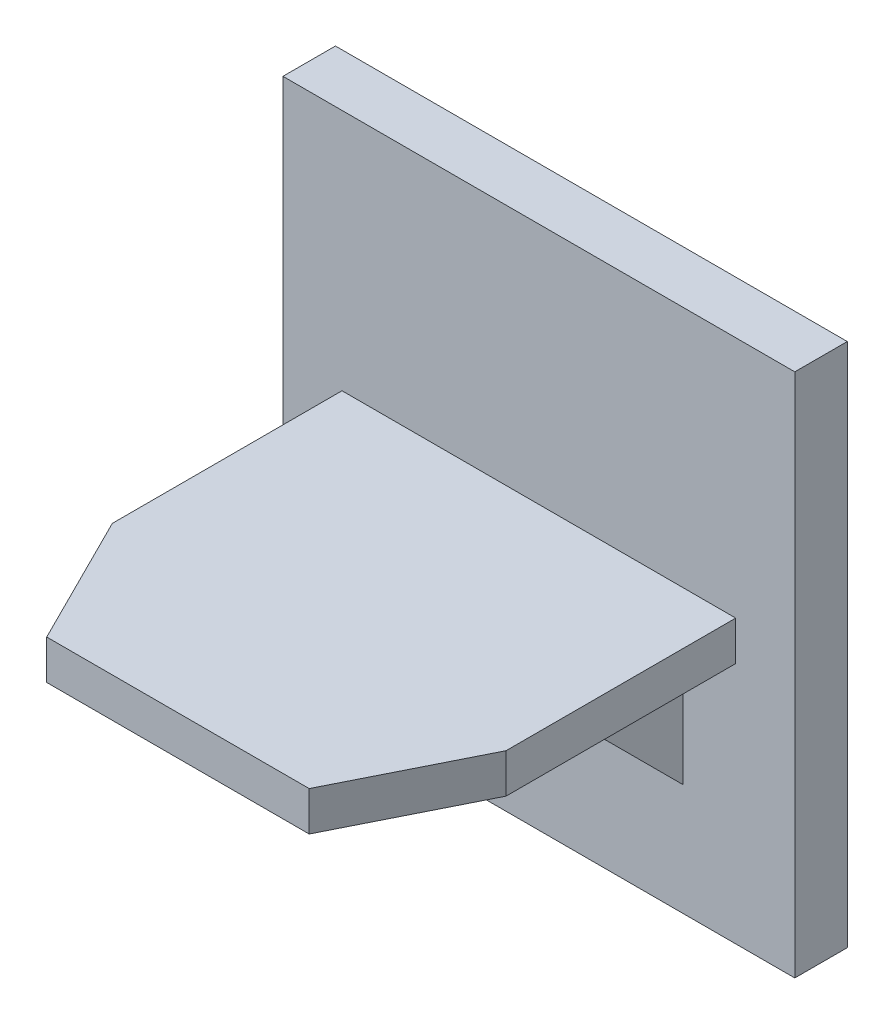
ISO-10303-21;
HEADER;
FILE_DESCRIPTION(('STEP AP214'),'2;1');
FILE_NAME('part.step','',(''),(''),'','','');
FILE_SCHEMA(('AUTOMOTIVE_DESIGN { 1 0 10303 214 1 1 1 1 }'));
ENDSEC;
DATA;
#1=APPLICATION_CONTEXT('core data for automotive mechanical design processes');
#2=APPLICATION_PROTOCOL_DEFINITION('international standard','automotive_design',2000,#1);
#3=PRODUCT_CONTEXT('',#1,'mechanical');
#4=PRODUCT('Part','Part','',(#3));
#5=PRODUCT_RELATED_PRODUCT_CATEGORY('part','',(#4));
#6=PRODUCT_DEFINITION_FORMATION('','',#4);
#7=PRODUCT_DEFINITION_CONTEXT('part definition',#1,'design');
#8=PRODUCT_DEFINITION('design','',#6,#7);
#9=PRODUCT_DEFINITION_SHAPE('','',#8);
#10=(LENGTH_UNIT() NAMED_UNIT(*) SI_UNIT(.MILLI.,.METRE.));
#11=(NAMED_UNIT(*) PLANE_ANGLE_UNIT() SI_UNIT($,.RADIAN.));
#12=(NAMED_UNIT(*) SI_UNIT($,.STERADIAN.) SOLID_ANGLE_UNIT());
#13=UNCERTAINTY_MEASURE_WITH_UNIT(LENGTH_MEASURE(1.E-05),#10,'distance_accuracy_value','');
#14=(GEOMETRIC_REPRESENTATION_CONTEXT(3) GLOBAL_UNCERTAINTY_ASSIGNED_CONTEXT((#13)) GLOBAL_UNIT_ASSIGNED_CONTEXT((#10,
#11,#12)) REPRESENTATION_CONTEXT('',''));
#15=CARTESIAN_POINT('',(0.,0.,0.));
#16=DIRECTION('',(0.,0.,1.));
#17=DIRECTION('',(1.,0.,0.));
#18=AXIS2_PLACEMENT_3D('',#15,#16,#17);
#19=CARTESIAN_POINT('',(0.,10.,0.));
#20=DIRECTION('',(0.,1.,0.));
#21=DIRECTION('',(1.,0.,0.));
#22=AXIS2_PLACEMENT_3D('',#19,#20,#21);
#23=PLANE('',#22);
#24=DIRECTION('',(0.,0.,-1.));
#25=VECTOR('',#24,1.);
#26=CARTESIAN_POINT('',(9.75,10.,0.5));
#27=LINE('',#26,#25);
#28=CARTESIAN_POINT('',(9.75,10.,1.));
#29=VERTEX_POINT('',#28);
#30=CARTESIAN_POINT('',(9.75,10.,-1.));
#31=VERTEX_POINT('',#30);
#32=EDGE_CURVE('E11',#29,#31,#27,.T.);
#33=ORIENTED_EDGE('',*,*,#32,.T.);
#34=DIRECTION('',(-1.,0.,0.));
#35=VECTOR('',#34,1.);
#36=CARTESIAN_POINT('',(10.,10.,-1.));
#37=LINE('',#36,#35);
#38=CARTESIAN_POINT('',(-9.75,10.,-1.));
#39=VERTEX_POINT('',#38);
#40=EDGE_CURVE('E44',#31,#39,#37,.T.);
#41=ORIENTED_EDGE('',*,*,#40,.T.);
#42=DIRECTION('',(0.,0.,1.));
#43=VECTOR('',#42,1.);
#44=CARTESIAN_POINT('',(-9.75,10.,-0.5));
#45=LINE('',#44,#43);
#46=CARTESIAN_POINT('',(-9.75,10.,1.));
#47=VERTEX_POINT('',#46);
#48=EDGE_CURVE('E234',#39,#47,#45,.T.);
#49=ORIENTED_EDGE('',*,*,#48,.T.);
#50=DIRECTION('',(1.,0.,0.));
#51=VECTOR('',#50,1.);
#52=CARTESIAN_POINT('',(-10.,10.,1.));
#53=LINE('',#52,#51);
#54=EDGE_CURVE('E264',#47,#29,#53,.T.);
#55=ORIENTED_EDGE('',*,*,#54,.T.);
#56=EDGE_LOOP('',(#33,#41,#49,#55));
#57=FACE_BOUND('',#56,.T.);
#58=ADVANCED_FACE('F18',(#57),#23,.T.);
#59=CARTESIAN_POINT('',(9.75,0.,1.));
#60=DIRECTION('',(1.,0.,0.));
#61=DIRECTION('',(0.,1.,0.));
#62=AXIS2_PLACEMENT_3D('',#59,#60,#61);
#63=PLANE('',#62);
#64=DIRECTION('',(0.,1.,0.));
#65=VECTOR('',#64,1.);
#66=CARTESIAN_POINT('',(9.75,0.,-1.));
#67=LINE('',#66,#65);
#68=CARTESIAN_POINT('',(9.75,-10.,-1.));
#69=VERTEX_POINT('',#68);
#70=EDGE_CURVE('E27',#69,#31,#67,.T.);
#71=ORIENTED_EDGE('',*,*,#70,.T.);
#72=ORIENTED_EDGE('',*,*,#32,.F.);
#73=DIRECTION('',(0.,-1.,0.));
#74=VECTOR('',#73,1.);
#75=CARTESIAN_POINT('',(9.75,0.,1.));
#76=LINE('',#75,#74);
#77=CARTESIAN_POINT('',(9.75,-10.,1.));
#78=VERTEX_POINT('',#77);
#79=EDGE_CURVE('E263',#29,#78,#76,.T.);
#80=ORIENTED_EDGE('',*,*,#79,.T.);
#81=DIRECTION('',(0.,0.,1.));
#82=VECTOR('',#81,1.);
#83=CARTESIAN_POINT('',(9.75,-10.,0.5));
#84=LINE('',#83,#82);
#85=EDGE_CURVE('E267',#69,#78,#84,.T.);
#86=ORIENTED_EDGE('',*,*,#85,.F.);
#87=EDGE_LOOP('',(#71,#72,#80,#86));
#88=FACE_BOUND('',#87,.T.);
#89=ADVANCED_FACE('F20',(#88),#63,.T.);
#90=CARTESIAN_POINT('',(10.,0.,-1.));
#91=DIRECTION('',(0.,0.,-1.));
#92=DIRECTION('',(0.,-1.,0.));
#93=AXIS2_PLACEMENT_3D('',#90,#91,#92);
#94=PLANE('',#93);
#95=DIRECTION('',(0.,1.,0.));
#96=VECTOR('',#95,1.);
#97=CARTESIAN_POINT('',(-9.75,0.,-1.));
#98=LINE('',#97,#96);
#99=CARTESIAN_POINT('',(-9.75,-10.,-1.));
#100=VERTEX_POINT('',#99);
#101=EDGE_CURVE('E231',#100,#39,#98,.T.);
#102=ORIENTED_EDGE('',*,*,#101,.T.);
#103=ORIENTED_EDGE('',*,*,#40,.F.);
#104=ORIENTED_EDGE('',*,*,#70,.F.);
#105=DIRECTION('',(1.,0.,0.));
#106=VECTOR('',#105,1.);
#107=CARTESIAN_POINT('',(10.,-10.,-1.));
#108=LINE('',#107,#106);
#109=EDGE_CURVE('E254',#100,#69,#108,.T.);
#110=ORIENTED_EDGE('',*,*,#109,.F.);
#111=EDGE_LOOP('',(#102,#103,#104,#110));
#112=FACE_BOUND('',#111,.T.);
#113=ADVANCED_FACE('F283',(#112),#94,.T.);
#114=CARTESIAN_POINT('',(-9.75,0.,-1.));
#115=DIRECTION('',(-1.,0.,0.));
#116=DIRECTION('',(0.,0.,1.));
#117=AXIS2_PLACEMENT_3D('',#114,#115,#116);
#118=PLANE('',#117);
#119=DIRECTION('',(0.,1.,0.));
#120=VECTOR('',#119,1.);
#121=CARTESIAN_POINT('',(-9.75,0.,1.));
#122=LINE('',#121,#120);
#123=CARTESIAN_POINT('',(-9.75,-10.,1.));
#124=VERTEX_POINT('',#123);
#125=EDGE_CURVE('E203',#124,#47,#122,.T.);
#126=ORIENTED_EDGE('',*,*,#125,.T.);
#127=ORIENTED_EDGE('',*,*,#48,.F.);
#128=ORIENTED_EDGE('',*,*,#101,.F.);
#129=DIRECTION('',(0.,0.,-1.));
#130=VECTOR('',#129,1.);
#131=CARTESIAN_POINT('',(-9.75,-10.,-0.5));
#132=LINE('',#131,#130);
#133=EDGE_CURVE('E270',#124,#100,#132,.T.);
#134=ORIENTED_EDGE('',*,*,#133,.F.);
#135=EDGE_LOOP('',(#126,#127,#128,#134));
#136=FACE_BOUND('',#135,.T.);
#137=ADVANCED_FACE('F286',(#136),#118,.T.);
#138=CARTESIAN_POINT('',(0.,-10.,0.));
#139=DIRECTION('',(0.,-1.,0.));
#140=DIRECTION('',(0.,0.,-1.));
#141=AXIS2_PLACEMENT_3D('',#138,#139,#140);
#142=PLANE('',#141);
#143=ORIENTED_EDGE('',*,*,#85,.T.);
#144=DIRECTION('',(-1.,0.,0.));
#145=VECTOR('',#144,1.);
#146=CARTESIAN_POINT('',(-10.,-10.,1.));
#147=LINE('',#146,#145);
#148=EDGE_CURVE('E259',#78,#124,#147,.T.);
#149=ORIENTED_EDGE('',*,*,#148,.T.);
#150=ORIENTED_EDGE('',*,*,#133,.T.);
#151=ORIENTED_EDGE('',*,*,#109,.T.);
#152=EDGE_LOOP('',(#143,#149,#150,#151));
#153=FACE_BOUND('',#152,.T.);
#154=ADVANCED_FACE('F340',(#153),#142,.T.);
#155=CARTESIAN_POINT('',(-10.,0.,1.));
#156=DIRECTION('',(0.,0.,1.));
#157=DIRECTION('',(1.,0.,0.));
#158=AXIS2_PLACEMENT_3D('',#155,#156,#157);
#159=PLANE('',#158);
#160=DIRECTION('',(0.,1.,0.));
#161=VECTOR('',#160,1.);
#162=CARTESIAN_POINT('',(-7.5,0.,1.));
#163=LINE('',#162,#161);
#164=CARTESIAN_POINT('',(-7.5,-0.75,1.));
#165=VERTEX_POINT('',#164);
#166=CARTESIAN_POINT('',(-7.5,0.75,1.));
#167=VERTEX_POINT('',#166);
#168=EDGE_CURVE('E171',#165,#167,#163,.T.);
#169=ORIENTED_EDGE('',*,*,#168,.T.);
#170=DIRECTION('',(1.,0.,0.));
#171=VECTOR('',#170,1.);
#172=CARTESIAN_POINT('',(-5.,0.75,1.));
#173=LINE('',#172,#171);
#174=CARTESIAN_POINT('',(7.5,0.75,1.));
#175=VERTEX_POINT('',#174);
#176=EDGE_CURVE('E200',#167,#175,#173,.T.);
#177=ORIENTED_EDGE('',*,*,#176,.T.);
#178=DIRECTION('',(0.,-1.,0.));
#179=VECTOR('',#178,1.);
#180=CARTESIAN_POINT('',(7.5,0.,1.));
#181=LINE('',#180,#179);
#182=CARTESIAN_POINT('',(7.5,-0.75,1.));
#183=VERTEX_POINT('',#182);
#184=EDGE_CURVE('E214',#175,#183,#181,.T.);
#185=ORIENTED_EDGE('',*,*,#184,.T.);
#186=DIRECTION('',(-1.,0.,0.));
#187=VECTOR('',#186,1.);
#188=CARTESIAN_POINT('',(7.5,-0.75,1.));
#189=LINE('',#188,#187);
#190=CARTESIAN_POINT('',(5.5,-0.75,1.));
#191=VERTEX_POINT('',#190);
#192=EDGE_CURVE('E224',#183,#191,#189,.T.);
#193=ORIENTED_EDGE('',*,*,#192,.T.);
#194=DIRECTION('',(0.,-1.,0.));
#195=VECTOR('',#194,1.);
#196=CARTESIAN_POINT('',(5.5,-5.75,1.));
#197=LINE('',#196,#195);
#198=CARTESIAN_POINT('',(5.5,-5.75,1.));
#199=VERTEX_POINT('',#198);
#200=EDGE_CURVE('E187',#191,#199,#197,.T.);
#201=ORIENTED_EDGE('',*,*,#200,.T.);
#202=DIRECTION('',(1.,0.,0.));
#203=VECTOR('',#202,1.);
#204=CARTESIAN_POINT('',(-5.,-5.75,1.));
#205=LINE('',#204,#203);
#206=CARTESIAN_POINT('',(-5.5,-5.75,1.));
#207=VERTEX_POINT('',#206);
#208=EDGE_CURVE('E186',#207,#199,#205,.T.);
#209=ORIENTED_EDGE('',*,*,#208,.F.);
#210=DIRECTION('',(0.,1.,0.));
#211=VECTOR('',#210,1.);
#212=CARTESIAN_POINT('',(-5.5,-2.,1.));
#213=LINE('',#212,#211);
#214=CARTESIAN_POINT('',(-5.5,-0.75,1.));
#215=VERTEX_POINT('',#214);
#216=EDGE_CURVE('E298',#207,#215,#213,.T.);
#217=ORIENTED_EDGE('',*,*,#216,.T.);
#218=DIRECTION('',(1.,0.,0.));
#219=VECTOR('',#218,1.);
#220=CARTESIAN_POINT('',(-7.5,-0.75,1.));
#221=LINE('',#220,#219);
#222=EDGE_CURVE('E156',#165,#215,#221,.T.);
#223=ORIENTED_EDGE('',*,*,#222,.F.);
#224=EDGE_LOOP('',(#169,#177,#185,#193,#201,#209,#217,#223));
#225=FACE_BOUND('',#224,.T.);
#226=ORIENTED_EDGE('',*,*,#125,.F.);
#227=ORIENTED_EDGE('',*,*,#148,.F.);
#228=ORIENTED_EDGE('',*,*,#79,.F.);
#229=ORIENTED_EDGE('',*,*,#54,.F.);
#230=EDGE_LOOP('',(#226,#227,#228,#229));
#231=FACE_BOUND('',#230,.T.);
#232=ADVANCED_FACE('F291',(#225,#231),#159,.T.);
#233=CARTESIAN_POINT('',(0.,0.75,6.875));
#234=DIRECTION('',(0.,1.,0.));
#235=DIRECTION('',(1.,0.,0.));
#236=AXIS2_PLACEMENT_3D('',#233,#234,#235);
#237=PLANE('',#236);
#238=ORIENTED_EDGE('',*,*,#176,.F.);
#239=DIRECTION('',(0.,0.,1.));
#240=VECTOR('',#239,1.);
#241=CARTESIAN_POINT('',(-7.5,0.75,9.75));
#242=LINE('',#241,#240);
#243=CARTESIAN_POINT('',(-7.5,0.75,9.75));
#244=VERTEX_POINT('',#243);
#245=EDGE_CURVE('E166',#167,#244,#242,.T.);
#246=ORIENTED_EDGE('',*,*,#245,.T.);
#247=DIRECTION('',(0.447213595499956,0.,0.894427190999917));
#248=VECTOR('',#247,1.);
#249=CARTESIAN_POINT('',(-5.,0.75,14.75));
#250=LINE('',#249,#248);
#251=CARTESIAN_POINT('',(-5.,0.75,14.75));
#252=VERTEX_POINT('',#251);
#253=EDGE_CURVE('E161',#244,#252,#250,.T.);
#254=ORIENTED_EDGE('',*,*,#253,.T.);
#255=DIRECTION('',(1.,0.,0.));
#256=VECTOR('',#255,1.);
#257=CARTESIAN_POINT('',(5.,0.75,14.75));
#258=LINE('',#257,#256);
#259=CARTESIAN_POINT('',(5.,0.75,14.75));
#260=VERTEX_POINT('',#259);
#261=EDGE_CURVE('E230',#252,#260,#258,.T.);
#262=ORIENTED_EDGE('',*,*,#261,.T.);
#263=DIRECTION('',(0.447213595499958,0.,-0.894427190999916));
#264=VECTOR('',#263,1.);
#265=CARTESIAN_POINT('',(5.,0.75,14.75));
#266=LINE('',#265,#264);
#267=CARTESIAN_POINT('',(7.5,0.75,9.75));
#268=VERTEX_POINT('',#267);
#269=EDGE_CURVE('E204',#260,#268,#266,.T.);
#270=ORIENTED_EDGE('',*,*,#269,.T.);
#271=DIRECTION('',(0.,0.,-1.));
#272=VECTOR('',#271,1.);
#273=CARTESIAN_POINT('',(7.5,0.75,1.));
#274=LINE('',#273,#272);
#275=EDGE_CURVE('E217',#268,#175,#274,.T.);
#276=ORIENTED_EDGE('',*,*,#275,.T.);
#277=EDGE_LOOP('',(#238,#246,#254,#262,#270,#276));
#278=FACE_BOUND('',#277,.T.);
#279=ADVANCED_FACE('F332',(#278),#237,.T.);
#280=CARTESIAN_POINT('',(5.,0.,14.75));
#281=DIRECTION('',(0.894427190999916,0.,0.447213595499958));
#282=DIRECTION('',(0.,-1.,0.));
#283=AXIS2_PLACEMENT_3D('',#280,#281,#282);
#284=PLANE('',#283);
#285=DIRECTION('',(0.,1.,0.));
#286=VECTOR('',#285,1.);
#287=CARTESIAN_POINT('',(7.5,0.,9.75));
#288=LINE('',#287,#286);
#289=CARTESIAN_POINT('',(7.5,-0.75,9.75));
#290=VERTEX_POINT('',#289);
#291=EDGE_CURVE('E248',#290,#268,#288,.T.);
#292=ORIENTED_EDGE('',*,*,#291,.T.);
#293=ORIENTED_EDGE('',*,*,#269,.F.);
#294=DIRECTION('',(0.,-1.,0.));
#295=VECTOR('',#294,1.);
#296=CARTESIAN_POINT('',(5.,0.,14.75));
#297=LINE('',#296,#295);
#298=CARTESIAN_POINT('',(5.,-0.75,14.75));
#299=VERTEX_POINT('',#298);
#300=EDGE_CURVE('E227',#260,#299,#297,.T.);
#301=ORIENTED_EDGE('',*,*,#300,.T.);
#302=DIRECTION('',(-0.447213595499958,0.,0.894427190999916));
#303=VECTOR('',#302,1.);
#304=CARTESIAN_POINT('',(5.,-0.75,14.75));
#305=LINE('',#304,#303);
#306=EDGE_CURVE('E211',#290,#299,#305,.T.);
#307=ORIENTED_EDGE('',*,*,#306,.F.);
#308=EDGE_LOOP('',(#292,#293,#301,#307));
#309=FACE_BOUND('',#308,.T.);
#310=ADVANCED_FACE('F326',(#309),#284,.T.);
#311=CARTESIAN_POINT('',(7.5,0.,9.75));
#312=DIRECTION('',(1.,0.,0.));
#313=DIRECTION('',(0.,1.,0.));
#314=AXIS2_PLACEMENT_3D('',#311,#312,#313);
#315=PLANE('',#314);
#316=DIRECTION('',(0.,0.,1.));
#317=VECTOR('',#316,1.);
#318=CARTESIAN_POINT('',(7.5,-0.75,1.));
#319=LINE('',#318,#317);
#320=EDGE_CURVE('E210',#183,#290,#319,.T.);
#321=ORIENTED_EDGE('',*,*,#320,.F.);
#322=ORIENTED_EDGE('',*,*,#184,.F.);
#323=ORIENTED_EDGE('',*,*,#275,.F.);
#324=ORIENTED_EDGE('',*,*,#291,.F.);
#325=EDGE_LOOP('',(#321,#322,#323,#324));
#326=FACE_BOUND('',#325,.T.);
#327=ADVANCED_FACE('F322',(#326),#315,.T.);
#328=CARTESIAN_POINT('',(-7.5,0.,9.75));
#329=DIRECTION('',(-0.894427190999917,0.,0.447213595499956));
#330=DIRECTION('',(0.,1.,0.));
#331=AXIS2_PLACEMENT_3D('',#328,#329,#330);
#332=PLANE('',#331);
#333=DIRECTION('',(0.,1.,0.));
#334=VECTOR('',#333,1.);
#335=CARTESIAN_POINT('',(-5.,0.,14.75));
#336=LINE('',#335,#334);
#337=CARTESIAN_POINT('',(-5.,-0.75,14.75));
#338=VERTEX_POINT('',#337);
#339=EDGE_CURVE('E238',#338,#252,#336,.T.);
#340=ORIENTED_EDGE('',*,*,#339,.T.);
#341=ORIENTED_EDGE('',*,*,#253,.F.);
#342=DIRECTION('',(0.,1.,0.));
#343=VECTOR('',#342,1.);
#344=CARTESIAN_POINT('',(-7.5,0.,9.75));
#345=LINE('',#344,#343);
#346=CARTESIAN_POINT('',(-7.5,-0.75,9.75));
#347=VERTEX_POINT('',#346);
#348=EDGE_CURVE('E159',#347,#244,#345,.T.);
#349=ORIENTED_EDGE('',*,*,#348,.F.);
#350=DIRECTION('',(-0.447213595499956,0.,-0.894427190999917));
#351=VECTOR('',#350,1.);
#352=CARTESIAN_POINT('',(-5.,-0.75,14.75));
#353=LINE('',#352,#351);
#354=EDGE_CURVE('E144',#338,#347,#353,.T.);
#355=ORIENTED_EDGE('',*,*,#354,.F.);
#356=EDGE_LOOP('',(#340,#341,#349,#355));
#357=FACE_BOUND('',#356,.T.);
#358=ADVANCED_FACE('F160',(#357),#332,.T.);
#359=CARTESIAN_POINT('',(-5.,0.,14.75));
#360=DIRECTION('',(0.,0.,1.));
#361=DIRECTION('',(1.,0.,0.));
#362=AXIS2_PLACEMENT_3D('',#359,#360,#361);
#363=PLANE('',#362);
#364=ORIENTED_EDGE('',*,*,#300,.F.);
#365=ORIENTED_EDGE('',*,*,#261,.F.);
#366=ORIENTED_EDGE('',*,*,#339,.F.);
#367=DIRECTION('',(-1.,0.,0.));
#368=VECTOR('',#367,1.);
#369=CARTESIAN_POINT('',(5.,-0.75,14.75));
#370=LINE('',#369,#368);
#371=EDGE_CURVE('E152',#299,#338,#370,.T.);
#372=ORIENTED_EDGE('',*,*,#371,.F.);
#373=EDGE_LOOP('',(#364,#365,#366,#372));
#374=FACE_BOUND('',#373,.T.);
#375=ADVANCED_FACE('F330',(#374),#363,.T.);
#376=CARTESIAN_POINT('',(0.,-0.75,6.875));
#377=DIRECTION('',(0.,-1.,0.));
#378=DIRECTION('',(0.,0.,-1.));
#379=AXIS2_PLACEMENT_3D('',#376,#377,#378);
#380=PLANE('',#379);
#381=ORIENTED_EDGE('',*,*,#320,.T.);
#382=ORIENTED_EDGE('',*,*,#306,.T.);
#383=ORIENTED_EDGE('',*,*,#371,.T.);
#384=ORIENTED_EDGE('',*,*,#354,.T.);
#385=DIRECTION('',(0.,0.,-1.));
#386=VECTOR('',#385,1.);
#387=CARTESIAN_POINT('',(-7.5,-0.75,9.75));
#388=LINE('',#387,#386);
#389=EDGE_CURVE('E149',#347,#165,#388,.T.);
#390=ORIENTED_EDGE('',*,*,#389,.T.);
#391=ORIENTED_EDGE('',*,*,#222,.T.);
#392=DIRECTION('',(0.,0.,1.));
#393=VECTOR('',#392,1.);
#394=CARTESIAN_POINT('',(-5.5,-0.75,4.75));
#395=LINE('',#394,#393);
#396=CARTESIAN_POINT('',(-5.5,-0.75,6.));
#397=VERTEX_POINT('',#396);
#398=EDGE_CURVE('E173',#215,#397,#395,.T.);
#399=ORIENTED_EDGE('',*,*,#398,.T.);
#400=DIRECTION('',(-1.,0.,0.));
#401=VECTOR('',#400,1.);
#402=CARTESIAN_POINT('',(-5.,-0.75,6.));
#403=LINE('',#402,#401);
#404=CARTESIAN_POINT('',(5.5,-0.75,6.));
#405=VERTEX_POINT('',#404);
#406=EDGE_CURVE('E207',#405,#397,#403,.T.);
#407=ORIENTED_EDGE('',*,*,#406,.F.);
#408=DIRECTION('',(0.,0.,-1.));
#409=VECTOR('',#408,1.);
#410=CARTESIAN_POINT('',(5.5,-0.75,6.));
#411=LINE('',#410,#409);
#412=EDGE_CURVE('E183',#405,#191,#411,.T.);
#413=ORIENTED_EDGE('',*,*,#412,.T.);
#414=ORIENTED_EDGE('',*,*,#192,.F.);
#415=EDGE_LOOP('',(#381,#382,#383,#384,#390,#391,#399,#407,#413,#414));
#416=FACE_BOUND('',#415,.T.);
#417=ADVANCED_FACE('F147',(#416),#380,.T.);
#418=CARTESIAN_POINT('',(-5.,-3.25,3.5));
#419=DIRECTION('',(0.,-0.707106781186548,0.707106781186547));
#420=DIRECTION('',(-1.,0.,0.));
#421=AXIS2_PLACEMENT_3D('',#418,#419,#420);
#422=PLANE('',#421);
#423=DIRECTION('',(0.,-0.707106781186547,-0.707106781186548));
#424=VECTOR('',#423,1.);
#425=CARTESIAN_POINT('',(-5.5,-3.25,3.5));
#426=LINE('',#425,#424);
#427=EDGE_CURVE('E180',#397,#207,#426,.T.);
#428=ORIENTED_EDGE('',*,*,#427,.T.);
#429=ORIENTED_EDGE('',*,*,#208,.T.);
#430=DIRECTION('',(0.,0.707106781186547,0.707106781186548));
#431=VECTOR('',#430,1.);
#432=CARTESIAN_POINT('',(5.5,-3.25,3.5));
#433=LINE('',#432,#431);
#434=EDGE_CURVE('E193',#199,#405,#433,.T.);
#435=ORIENTED_EDGE('',*,*,#434,.T.);
#436=ORIENTED_EDGE('',*,*,#406,.T.);
#437=EDGE_LOOP('',(#428,#429,#435,#436));
#438=FACE_BOUND('',#437,.T.);
#439=ADVANCED_FACE('F318',(#438),#422,.T.);
#440=CARTESIAN_POINT('',(5.5,-3.25,3.5));
#441=DIRECTION('',(-1.,0.,0.));
#442=DIRECTION('',(0.,0.,1.));
#443=AXIS2_PLACEMENT_3D('',#440,#441,#442);
#444=PLANE('',#443);
#445=ORIENTED_EDGE('',*,*,#434,.F.);
#446=ORIENTED_EDGE('',*,*,#200,.F.);
#447=ORIENTED_EDGE('',*,*,#412,.F.);
#448=EDGE_LOOP('',(#445,#446,#447));
#449=FACE_BOUND('',#448,.T.);
#450=ADVANCED_FACE('F317',(#449),#444,.F.);
#451=CARTESIAN_POINT('',(-7.5,0.,1.));
#452=DIRECTION('',(-1.,0.,0.));
#453=DIRECTION('',(0.,0.,1.));
#454=AXIS2_PLACEMENT_3D('',#451,#452,#453);
#455=PLANE('',#454);
#456=ORIENTED_EDGE('',*,*,#389,.F.);
#457=ORIENTED_EDGE('',*,*,#348,.T.);
#458=ORIENTED_EDGE('',*,*,#245,.F.);
#459=ORIENTED_EDGE('',*,*,#168,.F.);
#460=EDGE_LOOP('',(#456,#457,#458,#459));
#461=FACE_BOUND('',#460,.T.);
#462=ADVANCED_FACE('F169',(#461),#455,.T.);
#463=CARTESIAN_POINT('',(-5.5,-3.25,3.5));
#464=DIRECTION('',(1.,0.,0.));
#465=DIRECTION('',(0.,1.,0.));
#466=AXIS2_PLACEMENT_3D('',#463,#464,#465);
#467=PLANE('',#466);
#468=ORIENTED_EDGE('',*,*,#216,.F.);
#469=ORIENTED_EDGE('',*,*,#427,.F.);
#470=ORIENTED_EDGE('',*,*,#398,.F.);
#471=EDGE_LOOP('',(#468,#469,#470));
#472=FACE_BOUND('',#471,.T.);
#473=ADVANCED_FACE('F311',(#472),#467,.F.);
#474=CLOSED_SHELL('',(#58,#89,#113,#137,#154,#232,#279,#310,#327,#358,#375,#417,#439,#450,#462,#473));
#475=MANIFOLD_SOLID_BREP('B1',#474);
#476=ADVANCED_BREP_SHAPE_REPRESENTATION('',(#18,#475),#14);
#477=SHAPE_DEFINITION_REPRESENTATION(#9,#476);
ENDSEC;
END-ISO-10303-21;
